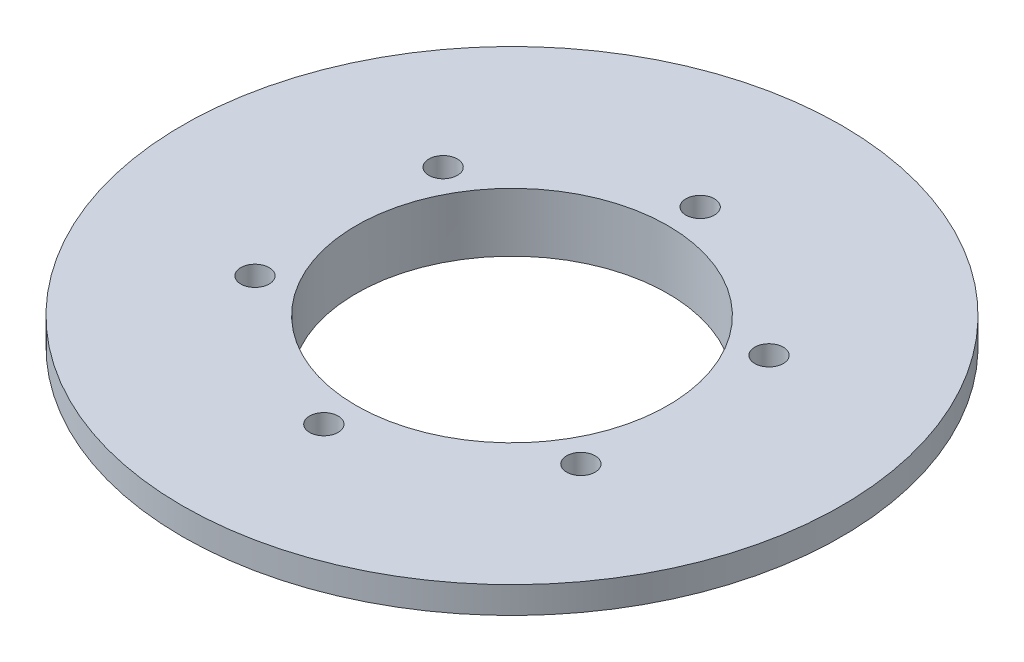
ISO-10303-21;
HEADER;
FILE_DESCRIPTION(('STEP AP214'),'2;1');
FILE_NAME('part.step','',(''),(''),'','','');
FILE_SCHEMA(('AUTOMOTIVE_DESIGN { 1 0 10303 214 1 1 1 1 }'));
ENDSEC;
DATA;
#1=APPLICATION_CONTEXT('core data for automotive mechanical design processes');
#2=APPLICATION_PROTOCOL_DEFINITION('international standard','automotive_design',2000,#1);
#3=PRODUCT_CONTEXT('',#1,'mechanical');
#4=PRODUCT('Part','Part','',(#3));
#5=PRODUCT_RELATED_PRODUCT_CATEGORY('part','',(#4));
#6=PRODUCT_DEFINITION_FORMATION('','',#4);
#7=PRODUCT_DEFINITION_CONTEXT('part definition',#1,'design');
#8=PRODUCT_DEFINITION('design','',#6,#7);
#9=PRODUCT_DEFINITION_SHAPE('','',#8);
#10=(LENGTH_UNIT() NAMED_UNIT(*) SI_UNIT(.MILLI.,.METRE.));
#11=(NAMED_UNIT(*) PLANE_ANGLE_UNIT() SI_UNIT($,.RADIAN.));
#12=(NAMED_UNIT(*) SI_UNIT($,.STERADIAN.) SOLID_ANGLE_UNIT());
#13=UNCERTAINTY_MEASURE_WITH_UNIT(LENGTH_MEASURE(1.E-05),#10,'distance_accuracy_value','');
#14=(GEOMETRIC_REPRESENTATION_CONTEXT(3) GLOBAL_UNCERTAINTY_ASSIGNED_CONTEXT((#13)) GLOBAL_UNIT_ASSIGNED_CONTEXT((#10,
#11,#12)) REPRESENTATION_CONTEXT('',''));
#15=CARTESIAN_POINT('',(0.,0.,0.));
#16=DIRECTION('',(0.,0.,1.));
#17=DIRECTION('',(1.,0.,0.));
#18=AXIS2_PLACEMENT_3D('',#15,#16,#17);
#19=CARTESIAN_POINT('',(0.,3.,0.));
#20=DIRECTION('',(0.,-1.,0.));
#21=DIRECTION('',(0.,0.,-1.));
#22=AXIS2_PLACEMENT_3D('',#19,#20,#21);
#23=PLANE('',#22);
#24=CARTESIAN_POINT('',(18.2947866549459,3.,-10.5624999999998));
#25=DIRECTION('',(0.,-1.,0.));
#26=DIRECTION('',(0.,0.,-1.));
#27=AXIS2_PLACEMENT_3D('',#24,#25,#26);
#28=CIRCLE('',#27,1.6);
#29=CARTESIAN_POINT('',(18.2947866549459,3.,-12.1624999999998));
#30=VERTEX_POINT('',#29);
#31=EDGE_CURVE('E130',#30,#30,#28,.T.);
#32=ORIENTED_EDGE('',*,*,#31,.T.);
#33=EDGE_LOOP('',(#32));
#34=FACE_BOUND('',#33,.T.);
#35=CARTESIAN_POINT('',(0.,3.,21.125));
#36=DIRECTION('',(0.,-1.,0.));
#37=DIRECTION('',(0.,0.,-1.));
#38=AXIS2_PLACEMENT_3D('',#35,#36,#37);
#39=CIRCLE('',#38,1.6);
#40=CARTESIAN_POINT('',(0.,3.,19.525));
#41=VERTEX_POINT('',#40);
#42=EDGE_CURVE('E134',#41,#41,#39,.T.);
#43=ORIENTED_EDGE('',*,*,#42,.T.);
#44=EDGE_LOOP('',(#43));
#45=FACE_BOUND('',#44,.T.);
#46=CARTESIAN_POINT('',(-2.55438031837585E-13,3.,-21.1249999999996));
#47=DIRECTION('',(0.,-1.,0.));
#48=DIRECTION('',(0.,0.,-1.));
#49=AXIS2_PLACEMENT_3D('',#46,#47,#48);
#50=CIRCLE('',#49,1.6);
#51=CARTESIAN_POINT('',(-2.55438031837585E-13,3.,-22.7249999999996));
#52=VERTEX_POINT('',#51);
#53=EDGE_CURVE('E138',#52,#52,#50,.T.);
#54=ORIENTED_EDGE('',*,*,#53,.T.);
#55=EDGE_LOOP('',(#54));
#56=FACE_BOUND('',#55,.T.);
#57=CARTESIAN_POINT('',(-18.2947866549463,3.,-10.5624999999996));
#58=DIRECTION('',(0.,-1.,0.));
#59=DIRECTION('',(0.,0.,-1.));
#60=AXIS2_PLACEMENT_3D('',#57,#58,#59);
#61=CIRCLE('',#60,1.6);
#62=CARTESIAN_POINT('',(-18.2947866549463,3.,-12.1624999999996));
#63=VERTEX_POINT('',#62);
#64=EDGE_CURVE('E142',#63,#63,#61,.T.);
#65=ORIENTED_EDGE('',*,*,#64,.T.);
#66=EDGE_LOOP('',(#65));
#67=FACE_BOUND('',#66,.T.);
#68=CARTESIAN_POINT('',(18.294786654946,3.,10.5625));
#69=DIRECTION('',(0.,-1.,0.));
#70=DIRECTION('',(0.,0.,-1.));
#71=AXIS2_PLACEMENT_3D('',#68,#69,#70);
#72=CIRCLE('',#71,1.6);
#73=CARTESIAN_POINT('',(18.294786654946,3.,8.96250000000001));
#74=VERTEX_POINT('',#73);
#75=EDGE_CURVE('E146',#74,#74,#72,.T.);
#76=ORIENTED_EDGE('',*,*,#75,.T.);
#77=EDGE_LOOP('',(#76));
#78=FACE_BOUND('',#77,.T.);
#79=CARTESIAN_POINT('',(-18.2947866549461,3.,10.5625000000002));
#80=DIRECTION('',(0.,-1.,0.));
#81=DIRECTION('',(0.,0.,-1.));
#82=AXIS2_PLACEMENT_3D('',#79,#80,#81);
#83=CIRCLE('',#82,1.6);
#84=CARTESIAN_POINT('',(-18.2947866549461,3.,8.96250000000022));
#85=VERTEX_POINT('',#84);
#86=EDGE_CURVE('E66',#85,#85,#83,.T.);
#87=ORIENTED_EDGE('',*,*,#86,.T.);
#88=EDGE_LOOP('',(#87));
#89=FACE_BOUND('',#88,.T.);
#90=CARTESIAN_POINT('',(0.,3.,0.));
#91=DIRECTION('',(0.,-1.,0.));
#92=DIRECTION('',(0.,0.,-1.));
#93=AXIS2_PLACEMENT_3D('',#90,#91,#92);
#94=CIRCLE('',#93,17.5);
#95=CARTESIAN_POINT('',(0.,3.,-17.5));
#96=VERTEX_POINT('',#95);
#97=EDGE_CURVE('E89',#96,#96,#94,.T.);
#98=ORIENTED_EDGE('',*,*,#97,.T.);
#99=EDGE_LOOP('',(#98));
#100=FACE_BOUND('',#99,.T.);
#101=CARTESIAN_POINT('',(0.,3.,0.));
#102=DIRECTION('',(0.,-1.,0.));
#103=DIRECTION('',(0.,0.,-1.));
#104=AXIS2_PLACEMENT_3D('',#101,#102,#103);
#105=CIRCLE('',#104,37.);
#106=CARTESIAN_POINT('',(0.,3.,-37.));
#107=VERTEX_POINT('',#106);
#108=EDGE_CURVE('E51',#107,#107,#105,.T.);
#109=ORIENTED_EDGE('',*,*,#108,.F.);
#110=EDGE_LOOP('',(#109));
#111=FACE_BOUND('',#110,.T.);
#112=ADVANCED_FACE('F43',(#34,#45,#56,#67,#78,#89,#100,#111),#23,.F.);
#113=CARTESIAN_POINT('',(0.,0.,0.));
#114=DIRECTION('',(0.,-1.,0.));
#115=DIRECTION('',(0.,0.,-1.));
#116=AXIS2_PLACEMENT_3D('',#113,#114,#115);
#117=CYLINDRICAL_SURFACE('',#116,37.);
#118=CARTESIAN_POINT('',(0.,0.,0.));
#119=DIRECTION('',(0.,-1.,0.));
#120=DIRECTION('',(0.,0.,-1.));
#121=AXIS2_PLACEMENT_3D('',#118,#119,#120);
#122=CIRCLE('',#121,37.);
#123=CARTESIAN_POINT('',(0.,0.,-37.));
#124=VERTEX_POINT('',#123);
#125=EDGE_CURVE('E57',#124,#124,#122,.T.);
#126=ORIENTED_EDGE('',*,*,#125,.F.);
#127=EDGE_LOOP('',(#126));
#128=FACE_BOUND('',#127,.T.);
#129=ORIENTED_EDGE('',*,*,#108,.T.);
#130=EDGE_LOOP('',(#129));
#131=FACE_BOUND('',#130,.T.);
#132=ADVANCED_FACE('F116',(#128,#131),#117,.T.);
#133=CARTESIAN_POINT('',(-34.3228484668613,0.,0.));
#134=DIRECTION('',(0.,1.,0.));
#135=DIRECTION('',(0.,0.,1.));
#136=AXIS2_PLACEMENT_3D('',#133,#134,#135);
#137=PLANE('',#136);
#138=CARTESIAN_POINT('',(0.,0.,0.));
#139=DIRECTION('',(0.,-1.,0.));
#140=DIRECTION('',(0.,0.,-1.));
#141=AXIS2_PLACEMENT_3D('',#138,#139,#140);
#142=CIRCLE('',#141,34.3228484668613);
#143=CARTESIAN_POINT('',(0.,0.,-34.3228484668613));
#144=VERTEX_POINT('',#143);
#145=EDGE_CURVE('E107',#144,#144,#142,.T.);
#146=ORIENTED_EDGE('',*,*,#145,.F.);
#147=EDGE_LOOP('',(#146));
#148=FACE_BOUND('',#147,.T.);
#149=ORIENTED_EDGE('',*,*,#125,.T.);
#150=EDGE_LOOP('',(#149));
#151=FACE_BOUND('',#150,.T.);
#152=ADVANCED_FACE('F114',(#148,#151),#137,.F.);
#153=CARTESIAN_POINT('',(0.,-0.100000000000004,0.));
#154=DIRECTION('',(0.,-1.,0.));
#155=DIRECTION('',(0.,0.,-1.));
#156=AXIS2_PLACEMENT_3D('',#153,#154,#155);
#157=TOROIDAL_SURFACE('',#156,32.,2.325);
#158=CARTESIAN_POINT('',(0.,0.,0.));
#159=DIRECTION('',(0.,-1.,0.));
#160=DIRECTION('',(0.,0.,-1.));
#161=AXIS2_PLACEMENT_3D('',#158,#159,#160);
#162=CIRCLE('',#161,29.6771515331387);
#163=CARTESIAN_POINT('',(0.,0.,-29.6771515331387));
#164=VERTEX_POINT('',#163);
#165=EDGE_CURVE('E103',#164,#164,#162,.T.);
#166=ORIENTED_EDGE('',*,*,#165,.F.);
#167=EDGE_LOOP('',(#166));
#168=FACE_BOUND('',#167,.T.);
#169=ORIENTED_EDGE('',*,*,#145,.T.);
#170=EDGE_LOOP('',(#169));
#171=FACE_BOUND('',#170,.T.);
#172=ADVANCED_FACE('F174',(#168,#171),#157,.F.);
#173=CARTESIAN_POINT('',(0.,0.,0.));
#174=DIRECTION('',(0.,1.,0.));
#175=DIRECTION('',(0.,0.,1.));
#176=AXIS2_PLACEMENT_3D('',#173,#174,#175);
#177=PLANE('',#176);
#178=CARTESIAN_POINT('',(0.,0.,0.));
#179=DIRECTION('',(0.,1.,0.));
#180=DIRECTION('',(0.,0.,1.));
#181=AXIS2_PLACEMENT_3D('',#178,#179,#180);
#182=CIRCLE('',#181,24.75);
#183=CARTESIAN_POINT('',(0.,0.,24.75));
#184=VERTEX_POINT('',#183);
#185=EDGE_CURVE('E10',#184,#184,#182,.F.);
#186=ORIENTED_EDGE('',*,*,#185,.F.);
#187=EDGE_LOOP('',(#186));
#188=FACE_BOUND('',#187,.T.);
#189=ORIENTED_EDGE('',*,*,#165,.T.);
#190=EDGE_LOOP('',(#189));
#191=FACE_BOUND('',#190,.T.);
#192=ADVANCED_FACE('F170',(#188,#191),#177,.F.);
#193=CARTESIAN_POINT('',(0.,-3.6,0.));
#194=DIRECTION('',(0.,1.,0.));
#195=DIRECTION('',(0.,0.,1.));
#196=AXIS2_PLACEMENT_3D('',#193,#194,#195);
#197=CYLINDRICAL_SURFACE('',#196,24.75);
#198=CARTESIAN_POINT('',(0.,-3.6,0.));
#199=DIRECTION('',(0.,-1.,0.));
#200=DIRECTION('',(0.,0.,-1.));
#201=AXIS2_PLACEMENT_3D('',#198,#199,#200);
#202=CIRCLE('',#201,24.75);
#203=CARTESIAN_POINT('',(0.,-3.6,-24.75));
#204=VERTEX_POINT('',#203);
#205=EDGE_CURVE('E95',#204,#204,#202,.T.);
#206=ORIENTED_EDGE('',*,*,#205,.F.);
#207=EDGE_LOOP('',(#206));
#208=FACE_BOUND('',#207,.T.);
#209=ORIENTED_EDGE('',*,*,#185,.T.);
#210=EDGE_LOOP('',(#209));
#211=FACE_BOUND('',#210,.T.);
#212=ADVANCED_FACE('F164',(#208,#211),#197,.T.);
#213=CARTESIAN_POINT('',(0.,-3.6,0.));
#214=DIRECTION('',(0.,-1.,0.));
#215=DIRECTION('',(0.,0.,-1.));
#216=AXIS2_PLACEMENT_3D('',#213,#214,#215);
#217=PLANE('',#216);
#218=CARTESIAN_POINT('',(18.2947866549459,-3.6,-10.5624999999998));
#219=DIRECTION('',(0.,-1.,0.));
#220=DIRECTION('',(0.,0.,-1.));
#221=AXIS2_PLACEMENT_3D('',#218,#219,#220);
#222=CIRCLE('',#221,1.6);
#223=CARTESIAN_POINT('',(18.2947866549459,-3.6,-12.1624999999998));
#224=VERTEX_POINT('',#223);
#225=EDGE_CURVE('E46',#224,#224,#222,.T.);
#226=ORIENTED_EDGE('',*,*,#225,.F.);
#227=EDGE_LOOP('',(#226));
#228=FACE_BOUND('',#227,.T.);
#229=CARTESIAN_POINT('',(0.,-3.6,21.125));
#230=DIRECTION('',(0.,-1.,0.));
#231=DIRECTION('',(0.,0.,-1.));
#232=AXIS2_PLACEMENT_3D('',#229,#230,#231);
#233=CIRCLE('',#232,1.6);
#234=CARTESIAN_POINT('',(0.,-3.6,19.525));
#235=VERTEX_POINT('',#234);
#236=EDGE_CURVE('E77',#235,#235,#233,.T.);
#237=ORIENTED_EDGE('',*,*,#236,.F.);
#238=EDGE_LOOP('',(#237));
#239=FACE_BOUND('',#238,.T.);
#240=CARTESIAN_POINT('',(-2.55438031837585E-13,-3.6,-21.1249999999996));
#241=DIRECTION('',(0.,-1.,0.));
#242=DIRECTION('',(0.,0.,-1.));
#243=AXIS2_PLACEMENT_3D('',#240,#241,#242);
#244=CIRCLE('',#243,1.6);
#245=CARTESIAN_POINT('',(-2.55438031837585E-13,-3.6,-22.7249999999996));
#246=VERTEX_POINT('',#245);
#247=EDGE_CURVE('E74',#246,#246,#244,.T.);
#248=ORIENTED_EDGE('',*,*,#247,.F.);
#249=EDGE_LOOP('',(#248));
#250=FACE_BOUND('',#249,.T.);
#251=CARTESIAN_POINT('',(-18.2947866549463,-3.6,-10.5624999999996));
#252=DIRECTION('',(0.,-1.,0.));
#253=DIRECTION('',(0.,0.,-1.));
#254=AXIS2_PLACEMENT_3D('',#251,#252,#253);
#255=CIRCLE('',#254,1.6);
#256=CARTESIAN_POINT('',(-18.2947866549463,-3.6,-12.1624999999996));
#257=VERTEX_POINT('',#256);
#258=EDGE_CURVE('E70',#257,#257,#255,.T.);
#259=ORIENTED_EDGE('',*,*,#258,.F.);
#260=EDGE_LOOP('',(#259));
#261=FACE_BOUND('',#260,.T.);
#262=CARTESIAN_POINT('',(18.294786654946,-3.6,10.5625));
#263=DIRECTION('',(0.,-1.,0.));
#264=DIRECTION('',(0.,0.,-1.));
#265=AXIS2_PLACEMENT_3D('',#262,#263,#264);
#266=CIRCLE('',#265,1.6);
#267=CARTESIAN_POINT('',(18.294786654946,-3.6,8.96250000000001));
#268=VERTEX_POINT('',#267);
#269=EDGE_CURVE('E65',#268,#268,#266,.T.);
#270=ORIENTED_EDGE('',*,*,#269,.F.);
#271=EDGE_LOOP('',(#270));
#272=FACE_BOUND('',#271,.T.);
#273=CARTESIAN_POINT('',(-18.2947866549461,-3.6,10.5625000000002));
#274=DIRECTION('',(0.,-1.,0.));
#275=DIRECTION('',(0.,0.,-1.));
#276=AXIS2_PLACEMENT_3D('',#273,#274,#275);
#277=CIRCLE('',#276,1.6);
#278=CARTESIAN_POINT('',(-18.2947866549461,-3.6,8.96250000000022));
#279=VERTEX_POINT('',#278);
#280=EDGE_CURVE('E61',#279,#279,#277,.T.);
#281=ORIENTED_EDGE('',*,*,#280,.F.);
#282=EDGE_LOOP('',(#281));
#283=FACE_BOUND('',#282,.T.);
#284=CARTESIAN_POINT('',(0.,-3.6,0.));
#285=DIRECTION('',(0.,1.,0.));
#286=DIRECTION('',(0.,0.,1.));
#287=AXIS2_PLACEMENT_3D('',#284,#285,#286);
#288=CIRCLE('',#287,17.5);
#289=CARTESIAN_POINT('',(0.,-3.6,17.5));
#290=VERTEX_POINT('',#289);
#291=EDGE_CURVE('E84',#290,#290,#288,.T.);
#292=ORIENTED_EDGE('',*,*,#291,.T.);
#293=EDGE_LOOP('',(#292));
#294=FACE_BOUND('',#293,.T.);
#295=ORIENTED_EDGE('',*,*,#205,.T.);
#296=EDGE_LOOP('',(#295));
#297=FACE_BOUND('',#296,.T.);
#298=ADVANCED_FACE('F154',(#228,#239,#250,#261,#272,#283,#294,#297),#217,.T.);
#299=CARTESIAN_POINT('',(0.,-3.6,0.));
#300=DIRECTION('',(0.,1.,0.));
#301=DIRECTION('',(0.,0.,1.));
#302=AXIS2_PLACEMENT_3D('',#299,#300,#301);
#303=CYLINDRICAL_SURFACE('',#302,17.5);
#304=ORIENTED_EDGE('',*,*,#291,.F.);
#305=EDGE_LOOP('',(#304));
#306=FACE_BOUND('',#305,.T.);
#307=ORIENTED_EDGE('',*,*,#97,.F.);
#308=EDGE_LOOP('',(#307));
#309=FACE_BOUND('',#308,.T.);
#310=ADVANCED_FACE('F152',(#306,#309),#303,.F.);
#311=CARTESIAN_POINT('',(-18.2947866549461,3.,10.5625000000002));
#312=DIRECTION('',(0.,-1.,0.));
#313=DIRECTION('',(0.,0.,-1.));
#314=AXIS2_PLACEMENT_3D('',#311,#312,#313);
#315=CYLINDRICAL_SURFACE('',#314,1.6);
#316=ORIENTED_EDGE('',*,*,#280,.T.);
#317=EDGE_LOOP('',(#316));
#318=FACE_BOUND('',#317,.T.);
#319=ORIENTED_EDGE('',*,*,#86,.F.);
#320=EDGE_LOOP('',(#319));
#321=FACE_BOUND('',#320,.T.);
#322=ADVANCED_FACE('F153',(#318,#321),#315,.F.);
#323=CARTESIAN_POINT('',(18.294786654946,3.,10.5625));
#324=DIRECTION('',(0.,-1.,0.));
#325=DIRECTION('',(0.,0.,-1.));
#326=AXIS2_PLACEMENT_3D('',#323,#324,#325);
#327=CYLINDRICAL_SURFACE('',#326,1.6);
#328=ORIENTED_EDGE('',*,*,#269,.T.);
#329=EDGE_LOOP('',(#328));
#330=FACE_BOUND('',#329,.T.);
#331=ORIENTED_EDGE('',*,*,#75,.F.);
#332=EDGE_LOOP('',(#331));
#333=FACE_BOUND('',#332,.T.);
#334=ADVANCED_FACE('F161',(#330,#333),#327,.F.);
#335=CARTESIAN_POINT('',(-18.2947866549463,3.,-10.5624999999996));
#336=DIRECTION('',(0.,-1.,0.));
#337=DIRECTION('',(0.,0.,-1.));
#338=AXIS2_PLACEMENT_3D('',#335,#336,#337);
#339=CYLINDRICAL_SURFACE('',#338,1.6);
#340=ORIENTED_EDGE('',*,*,#258,.T.);
#341=EDGE_LOOP('',(#340));
#342=FACE_BOUND('',#341,.T.);
#343=ORIENTED_EDGE('',*,*,#64,.F.);
#344=EDGE_LOOP('',(#343));
#345=FACE_BOUND('',#344,.T.);
#346=ADVANCED_FACE('F228',(#342,#345),#339,.F.);
#347=CARTESIAN_POINT('',(-2.55438031837585E-13,3.,-21.1249999999996));
#348=DIRECTION('',(0.,-1.,0.));
#349=DIRECTION('',(0.,0.,-1.));
#350=AXIS2_PLACEMENT_3D('',#347,#348,#349);
#351=CYLINDRICAL_SURFACE('',#350,1.6);
#352=ORIENTED_EDGE('',*,*,#247,.T.);
#353=EDGE_LOOP('',(#352));
#354=FACE_BOUND('',#353,.T.);
#355=ORIENTED_EDGE('',*,*,#53,.F.);
#356=EDGE_LOOP('',(#355));
#357=FACE_BOUND('',#356,.T.);
#358=ADVANCED_FACE('F238',(#354,#357),#351,.F.);
#359=CARTESIAN_POINT('',(0.,3.,21.125));
#360=DIRECTION('',(0.,-1.,0.));
#361=DIRECTION('',(0.,0.,-1.));
#362=AXIS2_PLACEMENT_3D('',#359,#360,#361);
#363=CYLINDRICAL_SURFACE('',#362,1.6);
#364=ORIENTED_EDGE('',*,*,#236,.T.);
#365=EDGE_LOOP('',(#364));
#366=FACE_BOUND('',#365,.T.);
#367=ORIENTED_EDGE('',*,*,#42,.F.);
#368=EDGE_LOOP('',(#367));
#369=FACE_BOUND('',#368,.T.);
#370=ADVANCED_FACE('F248',(#366,#369),#363,.F.);
#371=CARTESIAN_POINT('',(18.2947866549459,3.,-10.5624999999998));
#372=DIRECTION('',(0.,-1.,0.));
#373=DIRECTION('',(0.,0.,-1.));
#374=AXIS2_PLACEMENT_3D('',#371,#372,#373);
#375=CYLINDRICAL_SURFACE('',#374,1.6);
#376=ORIENTED_EDGE('',*,*,#225,.T.);
#377=EDGE_LOOP('',(#376));
#378=FACE_BOUND('',#377,.T.);
#379=ORIENTED_EDGE('',*,*,#31,.F.);
#380=EDGE_LOOP('',(#379));
#381=FACE_BOUND('',#380,.T.);
#382=ADVANCED_FACE('F257',(#378,#381),#375,.F.);
#383=CLOSED_SHELL('',(#112,#132,#152,#172,#192,#212,#298,#310,#322,#334,#346,#358,#370,#382));
#384=MANIFOLD_SOLID_BREP('B2',#383);
#385=ADVANCED_BREP_SHAPE_REPRESENTATION('',(#18,#384),#14);
#386=SHAPE_DEFINITION_REPRESENTATION(#9,#385);
ENDSEC;
END-ISO-10303-21;
